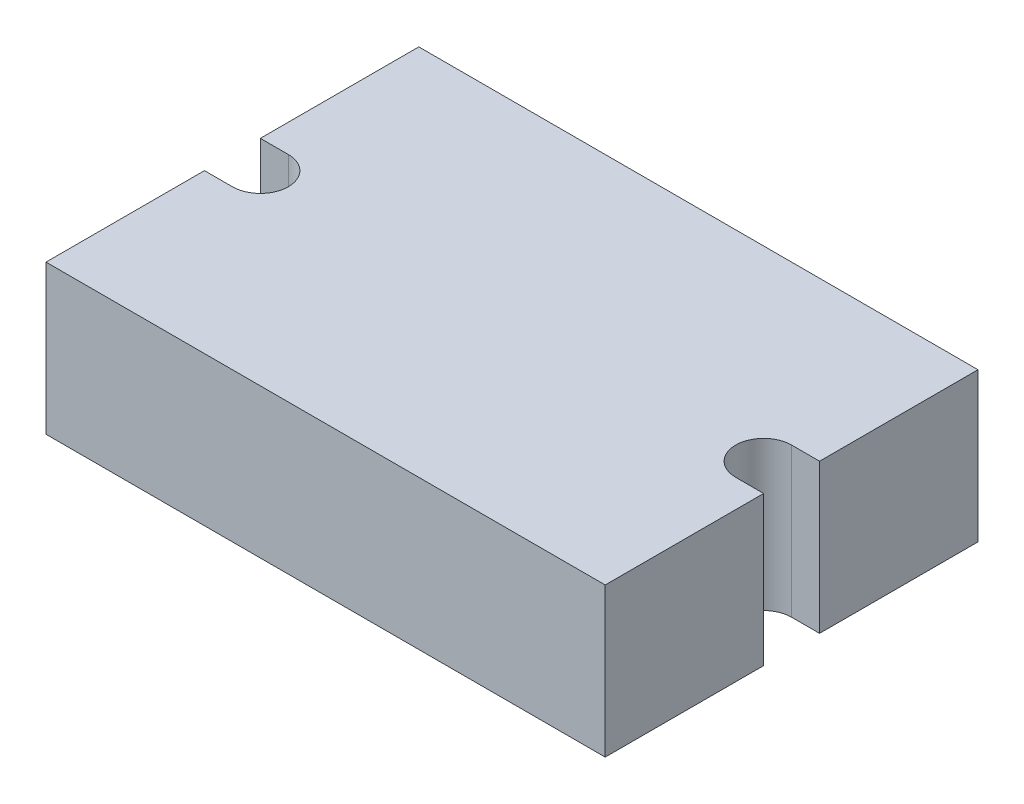
ISO-10303-21;
HEADER;
FILE_DESCRIPTION(('STEP AP214'),'2;1');
FILE_NAME('part.step','',(''),(''),'','','');
FILE_SCHEMA(('AUTOMOTIVE_DESIGN { 1 0 10303 214 1 1 1 1 }'));
ENDSEC;
DATA;
#1=APPLICATION_CONTEXT('core data for automotive mechanical design processes');
#2=APPLICATION_PROTOCOL_DEFINITION('international standard','automotive_design',2000,#1);
#3=PRODUCT_CONTEXT('',#1,'mechanical');
#4=PRODUCT('Part','Part','',(#3));
#5=PRODUCT_RELATED_PRODUCT_CATEGORY('part','',(#4));
#6=PRODUCT_DEFINITION_FORMATION('','',#4);
#7=PRODUCT_DEFINITION_CONTEXT('part definition',#1,'design');
#8=PRODUCT_DEFINITION('design','',#6,#7);
#9=PRODUCT_DEFINITION_SHAPE('','',#8);
#10=(LENGTH_UNIT() NAMED_UNIT(*) SI_UNIT(.MILLI.,.METRE.));
#11=(NAMED_UNIT(*) PLANE_ANGLE_UNIT() SI_UNIT($,.RADIAN.));
#12=(NAMED_UNIT(*) SI_UNIT($,.STERADIAN.) SOLID_ANGLE_UNIT());
#13=UNCERTAINTY_MEASURE_WITH_UNIT(LENGTH_MEASURE(1.E-05),#10,'distance_accuracy_value','');
#14=(GEOMETRIC_REPRESENTATION_CONTEXT(3) GLOBAL_UNCERTAINTY_ASSIGNED_CONTEXT((#13)) GLOBAL_UNIT_ASSIGNED_CONTEXT((#10,
#11,#12)) REPRESENTATION_CONTEXT('',''));
#15=CARTESIAN_POINT('',(0.,0.,0.));
#16=DIRECTION('',(0.,0.,1.));
#17=DIRECTION('',(1.,0.,0.));
#18=AXIS2_PLACEMENT_3D('',#15,#16,#17);
#19=CARTESIAN_POINT('',(0.,8.,-8.5));
#20=DIRECTION('',(1.,0.,0.));
#21=DIRECTION('',(0.,0.,-1.));
#22=AXIS2_PLACEMENT_3D('',#19,#20,#21);
#23=PLANE('',#22);
#24=DIRECTION('',(0.,0.,1.));
#25=VECTOR('',#24,1.);
#26=CARTESIAN_POINT('',(0.,0.,-8.5));
#27=LINE('',#26,#25);
#28=CARTESIAN_POINT('',(0.,0.,-8.5));
#29=VERTEX_POINT('',#28);
#30=CARTESIAN_POINT('',(0.,0.,0.));
#31=VERTEX_POINT('',#30);
#32=EDGE_CURVE('E168',#29,#31,#27,.T.);
#33=ORIENTED_EDGE('',*,*,#32,.T.);
#34=DIRECTION('',(0.,-1.,0.));
#35=VECTOR('',#34,1.);
#36=CARTESIAN_POINT('',(0.,8.,0.));
#37=LINE('',#36,#35);
#38=CARTESIAN_POINT('',(0.,8.,0.));
#39=VERTEX_POINT('',#38);
#40=EDGE_CURVE('E11',#39,#31,#37,.T.);
#41=ORIENTED_EDGE('',*,*,#40,.F.);
#42=DIRECTION('',(0.,0.,1.));
#43=VECTOR('',#42,1.);
#44=CARTESIAN_POINT('',(0.,8.,-8.5));
#45=LINE('',#44,#43);
#46=CARTESIAN_POINT('',(0.,8.,-8.5));
#47=VERTEX_POINT('',#46);
#48=EDGE_CURVE('E202',#47,#39,#45,.T.);
#49=ORIENTED_EDGE('',*,*,#48,.F.);
#50=DIRECTION('',(0.,-1.,0.));
#51=VECTOR('',#50,1.);
#52=CARTESIAN_POINT('',(0.,8.,-8.5));
#53=LINE('',#52,#51);
#54=EDGE_CURVE('E164',#47,#29,#53,.T.);
#55=ORIENTED_EDGE('',*,*,#54,.T.);
#56=EDGE_LOOP('',(#33,#41,#49,#55));
#57=FACE_BOUND('',#56,.T.);
#58=ADVANCED_FACE('F43',(#57),#23,.F.);
#59=CARTESIAN_POINT('',(0.,8.,0.));
#60=DIRECTION('',(0.,0.,-1.));
#61=DIRECTION('',(-1.,0.,0.));
#62=AXIS2_PLACEMENT_3D('',#59,#60,#61);
#63=PLANE('',#62);
#64=DIRECTION('',(1.,0.,0.));
#65=VECTOR('',#64,1.);
#66=CARTESIAN_POINT('',(0.,0.,0.));
#67=LINE('',#66,#65);
#68=CARTESIAN_POINT('',(30.,0.,0.));
#69=VERTEX_POINT('',#68);
#70=EDGE_CURVE('E172',#31,#69,#67,.T.);
#71=ORIENTED_EDGE('',*,*,#70,.T.);
#72=DIRECTION('',(0.,-1.,0.));
#73=VECTOR('',#72,1.);
#74=CARTESIAN_POINT('',(30.,8.,0.));
#75=LINE('',#74,#73);
#76=CARTESIAN_POINT('',(30.,8.,0.));
#77=VERTEX_POINT('',#76);
#78=EDGE_CURVE('E52',#77,#69,#75,.T.);
#79=ORIENTED_EDGE('',*,*,#78,.F.);
#80=DIRECTION('',(1.,0.,0.));
#81=VECTOR('',#80,1.);
#82=CARTESIAN_POINT('',(0.,8.,0.));
#83=LINE('',#82,#81);
#84=EDGE_CURVE('E115',#39,#77,#83,.T.);
#85=ORIENTED_EDGE('',*,*,#84,.F.);
#86=ORIENTED_EDGE('',*,*,#40,.T.);
#87=EDGE_LOOP('',(#71,#79,#85,#86));
#88=FACE_BOUND('',#87,.T.);
#89=ADVANCED_FACE('F296',(#88),#63,.F.);
#90=CARTESIAN_POINT('',(30.,8.,-8.5));
#91=DIRECTION('',(-1.,0.,0.));
#92=DIRECTION('',(0.,0.,1.));
#93=AXIS2_PLACEMENT_3D('',#90,#91,#92);
#94=PLANE('',#93);
#95=DIRECTION('',(0.,0.,-1.));
#96=VECTOR('',#95,1.);
#97=CARTESIAN_POINT('',(30.,0.,-8.5));
#98=LINE('',#97,#96);
#99=CARTESIAN_POINT('',(30.,0.,-8.5));
#100=VERTEX_POINT('',#99);
#101=EDGE_CURVE('E175',#69,#100,#98,.T.);
#102=ORIENTED_EDGE('',*,*,#101,.T.);
#103=DIRECTION('',(0.,-1.,0.));
#104=VECTOR('',#103,1.);
#105=CARTESIAN_POINT('',(30.,8.,-8.5));
#106=LINE('',#105,#104);
#107=CARTESIAN_POINT('',(30.,8.,-8.5));
#108=VERTEX_POINT('',#107);
#109=EDGE_CURVE('E229',#108,#100,#106,.T.);
#110=ORIENTED_EDGE('',*,*,#109,.F.);
#111=DIRECTION('',(0.,0.,-1.));
#112=VECTOR('',#111,1.);
#113=CARTESIAN_POINT('',(30.,8.,-8.5));
#114=LINE('',#113,#112);
#115=EDGE_CURVE('E239',#77,#108,#114,.T.);
#116=ORIENTED_EDGE('',*,*,#115,.F.);
#117=ORIENTED_EDGE('',*,*,#78,.T.);
#118=EDGE_LOOP('',(#102,#110,#116,#117));
#119=FACE_BOUND('',#118,.T.);
#120=ADVANCED_FACE('F237',(#119),#94,.F.);
#121=CARTESIAN_POINT('',(28.5,8.,-8.5));
#122=DIRECTION('',(0.,0.,1.));
#123=DIRECTION('',(1.,0.,0.));
#124=AXIS2_PLACEMENT_3D('',#121,#122,#123);
#125=PLANE('',#124);
#126=DIRECTION('',(-1.,0.,0.));
#127=VECTOR('',#126,1.);
#128=CARTESIAN_POINT('',(28.5,0.,-8.5));
#129=LINE('',#128,#127);
#130=CARTESIAN_POINT('',(28.5,0.,-8.5));
#131=VERTEX_POINT('',#130);
#132=EDGE_CURVE('E178',#100,#131,#129,.T.);
#133=ORIENTED_EDGE('',*,*,#132,.T.);
#134=DIRECTION('',(0.,-1.,0.));
#135=VECTOR('',#134,1.);
#136=CARTESIAN_POINT('',(28.5,8.,-8.5));
#137=LINE('',#136,#135);
#138=CARTESIAN_POINT('',(28.5,8.,-8.5));
#139=VERTEX_POINT('',#138);
#140=EDGE_CURVE('E225',#139,#131,#137,.T.);
#141=ORIENTED_EDGE('',*,*,#140,.F.);
#142=DIRECTION('',(-1.,0.,0.));
#143=VECTOR('',#142,1.);
#144=CARTESIAN_POINT('',(28.5,8.,-8.5));
#145=LINE('',#144,#143);
#146=EDGE_CURVE('E258',#108,#139,#145,.T.);
#147=ORIENTED_EDGE('',*,*,#146,.F.);
#148=ORIENTED_EDGE('',*,*,#109,.T.);
#149=EDGE_LOOP('',(#133,#141,#147,#148));
#150=FACE_BOUND('',#149,.T.);
#151=ADVANCED_FACE('F248',(#150),#125,.F.);
#152=CARTESIAN_POINT('',(28.5,8.,-10.));
#153=DIRECTION('',(0.,-1.,0.));
#154=DIRECTION('',(0.,0.,-1.));
#155=AXIS2_PLACEMENT_3D('',#152,#153,#154);
#156=CYLINDRICAL_SURFACE('',#155,1.5);
#157=CARTESIAN_POINT('',(28.5,0.,-10.));
#158=DIRECTION('',(0.,-1.,0.));
#159=DIRECTION('',(0.,0.,-1.));
#160=AXIS2_PLACEMENT_3D('',#157,#158,#159);
#161=CIRCLE('',#160,1.5);
#162=CARTESIAN_POINT('',(28.5,0.,-11.5));
#163=VERTEX_POINT('',#162);
#164=EDGE_CURVE('E181',#131,#163,#161,.T.);
#165=ORIENTED_EDGE('',*,*,#164,.T.);
#166=DIRECTION('',(0.,-1.,0.));
#167=VECTOR('',#166,1.);
#168=CARTESIAN_POINT('',(28.5,8.,-11.5));
#169=LINE('',#168,#167);
#170=CARTESIAN_POINT('',(28.5,8.,-11.5));
#171=VERTEX_POINT('',#170);
#172=EDGE_CURVE('E221',#171,#163,#169,.T.);
#173=ORIENTED_EDGE('',*,*,#172,.F.);
#174=CARTESIAN_POINT('',(28.5,8.,-10.));
#175=DIRECTION('',(0.,-1.,0.));
#176=DIRECTION('',(0.,0.,-1.));
#177=AXIS2_PLACEMENT_3D('',#174,#175,#176);
#178=CIRCLE('',#177,1.5);
#179=EDGE_CURVE('E254',#139,#171,#178,.T.);
#180=ORIENTED_EDGE('',*,*,#179,.F.);
#181=ORIENTED_EDGE('',*,*,#140,.T.);
#182=EDGE_LOOP('',(#165,#173,#180,#181));
#183=FACE_BOUND('',#182,.T.);
#184=ADVANCED_FACE('F252',(#183),#156,.F.);
#185=CARTESIAN_POINT('',(28.5,8.,-11.5));
#186=DIRECTION('',(0.,0.,-1.));
#187=DIRECTION('',(-1.,0.,0.));
#188=AXIS2_PLACEMENT_3D('',#185,#186,#187);
#189=PLANE('',#188);
#190=DIRECTION('',(1.,0.,0.));
#191=VECTOR('',#190,1.);
#192=CARTESIAN_POINT('',(28.5,0.,-11.5));
#193=LINE('',#192,#191);
#194=CARTESIAN_POINT('',(30.,0.,-11.5));
#195=VERTEX_POINT('',#194);
#196=EDGE_CURVE('E184',#163,#195,#193,.T.);
#197=ORIENTED_EDGE('',*,*,#196,.T.);
#198=DIRECTION('',(0.,-1.,0.));
#199=VECTOR('',#198,1.);
#200=CARTESIAN_POINT('',(30.,8.,-11.5));
#201=LINE('',#200,#199);
#202=CARTESIAN_POINT('',(30.,8.,-11.5));
#203=VERTEX_POINT('',#202);
#204=EDGE_CURVE('E217',#203,#195,#201,.T.);
#205=ORIENTED_EDGE('',*,*,#204,.F.);
#206=DIRECTION('',(1.,0.,0.));
#207=VECTOR('',#206,1.);
#208=CARTESIAN_POINT('',(28.5,8.,-11.5));
#209=LINE('',#208,#207);
#210=EDGE_CURVE('E257',#171,#203,#209,.T.);
#211=ORIENTED_EDGE('',*,*,#210,.F.);
#212=ORIENTED_EDGE('',*,*,#172,.T.);
#213=EDGE_LOOP('',(#197,#205,#211,#212));
#214=FACE_BOUND('',#213,.T.);
#215=ADVANCED_FACE('F309',(#214),#189,.F.);
#216=CARTESIAN_POINT('',(30.,8.,-11.5));
#217=DIRECTION('',(-1.,0.,0.));
#218=DIRECTION('',(0.,0.,1.));
#219=AXIS2_PLACEMENT_3D('',#216,#217,#218);
#220=PLANE('',#219);
#221=DIRECTION('',(0.,0.,-1.));
#222=VECTOR('',#221,1.);
#223=CARTESIAN_POINT('',(30.,0.,-11.5));
#224=LINE('',#223,#222);
#225=CARTESIAN_POINT('',(30.,0.,-20.));
#226=VERTEX_POINT('',#225);
#227=EDGE_CURVE('E187',#195,#226,#224,.T.);
#228=ORIENTED_EDGE('',*,*,#227,.T.);
#229=DIRECTION('',(0.,-1.,0.));
#230=VECTOR('',#229,1.);
#231=CARTESIAN_POINT('',(30.,8.,-20.));
#232=LINE('',#231,#230);
#233=CARTESIAN_POINT('',(30.,8.,-20.));
#234=VERTEX_POINT('',#233);
#235=EDGE_CURVE('E213',#234,#226,#232,.T.);
#236=ORIENTED_EDGE('',*,*,#235,.F.);
#237=DIRECTION('',(0.,0.,-1.));
#238=VECTOR('',#237,1.);
#239=CARTESIAN_POINT('',(30.,8.,-11.5));
#240=LINE('',#239,#238);
#241=EDGE_CURVE('E262',#203,#234,#240,.T.);
#242=ORIENTED_EDGE('',*,*,#241,.F.);
#243=ORIENTED_EDGE('',*,*,#204,.T.);
#244=EDGE_LOOP('',(#228,#236,#242,#243));
#245=FACE_BOUND('',#244,.T.);
#246=ADVANCED_FACE('F312',(#245),#220,.F.);
#247=CARTESIAN_POINT('',(0.,8.,-20.));
#248=DIRECTION('',(0.,0.,1.));
#249=DIRECTION('',(1.,0.,0.));
#250=AXIS2_PLACEMENT_3D('',#247,#248,#249);
#251=PLANE('',#250);
#252=DIRECTION('',(-1.,0.,0.));
#253=VECTOR('',#252,1.);
#254=CARTESIAN_POINT('',(0.,0.,-20.));
#255=LINE('',#254,#253);
#256=CARTESIAN_POINT('',(0.,0.,-20.));
#257=VERTEX_POINT('',#256);
#258=EDGE_CURVE('E190',#226,#257,#255,.T.);
#259=ORIENTED_EDGE('',*,*,#258,.T.);
#260=DIRECTION('',(0.,-1.,0.));
#261=VECTOR('',#260,1.);
#262=CARTESIAN_POINT('',(0.,8.,-20.));
#263=LINE('',#262,#261);
#264=CARTESIAN_POINT('',(0.,8.,-20.));
#265=VERTEX_POINT('',#264);
#266=EDGE_CURVE('E209',#265,#257,#263,.T.);
#267=ORIENTED_EDGE('',*,*,#266,.F.);
#268=DIRECTION('',(-1.,0.,0.));
#269=VECTOR('',#268,1.);
#270=CARTESIAN_POINT('',(0.,8.,-20.));
#271=LINE('',#270,#269);
#272=EDGE_CURVE('E269',#234,#265,#271,.T.);
#273=ORIENTED_EDGE('',*,*,#272,.F.);
#274=ORIENTED_EDGE('',*,*,#235,.T.);
#275=EDGE_LOOP('',(#259,#267,#273,#274));
#276=FACE_BOUND('',#275,.T.);
#277=ADVANCED_FACE('F277',(#276),#251,.F.);
#278=CARTESIAN_POINT('',(0.,8.,-11.5));
#279=DIRECTION('',(1.,0.,0.));
#280=DIRECTION('',(0.,0.,-1.));
#281=AXIS2_PLACEMENT_3D('',#278,#279,#280);
#282=PLANE('',#281);
#283=DIRECTION('',(0.,0.,1.));
#284=VECTOR('',#283,1.);
#285=CARTESIAN_POINT('',(0.,0.,-11.5));
#286=LINE('',#285,#284);
#287=CARTESIAN_POINT('',(0.,0.,-11.5));
#288=VERTEX_POINT('',#287);
#289=EDGE_CURVE('E193',#257,#288,#286,.T.);
#290=ORIENTED_EDGE('',*,*,#289,.T.);
#291=DIRECTION('',(0.,-1.,0.));
#292=VECTOR('',#291,1.);
#293=CARTESIAN_POINT('',(0.,8.,-11.5));
#294=LINE('',#293,#292);
#295=CARTESIAN_POINT('',(0.,8.,-11.5));
#296=VERTEX_POINT('',#295);
#297=EDGE_CURVE('E157',#296,#288,#294,.T.);
#298=ORIENTED_EDGE('',*,*,#297,.F.);
#299=DIRECTION('',(0.,0.,1.));
#300=VECTOR('',#299,1.);
#301=CARTESIAN_POINT('',(0.,8.,-11.5));
#302=LINE('',#301,#300);
#303=EDGE_CURVE('E146',#265,#296,#302,.T.);
#304=ORIENTED_EDGE('',*,*,#303,.F.);
#305=ORIENTED_EDGE('',*,*,#266,.T.);
#306=EDGE_LOOP('',(#290,#298,#304,#305));
#307=FACE_BOUND('',#306,.T.);
#308=ADVANCED_FACE('F281',(#307),#282,.F.);
#309=CARTESIAN_POINT('',(1.5,8.,-11.5));
#310=DIRECTION('',(0.,0.,-1.));
#311=DIRECTION('',(-1.,0.,0.));
#312=AXIS2_PLACEMENT_3D('',#309,#310,#311);
#313=PLANE('',#312);
#314=DIRECTION('',(1.,0.,0.));
#315=VECTOR('',#314,1.);
#316=CARTESIAN_POINT('',(1.5,0.,-11.5));
#317=LINE('',#316,#315);
#318=CARTESIAN_POINT('',(1.5,0.,-11.5));
#319=VERTEX_POINT('',#318);
#320=EDGE_CURVE('E155',#288,#319,#317,.T.);
#321=ORIENTED_EDGE('',*,*,#320,.T.);
#322=DIRECTION('',(0.,-1.,0.));
#323=VECTOR('',#322,1.);
#324=CARTESIAN_POINT('',(1.5,8.,-11.5));
#325=LINE('',#324,#323);
#326=CARTESIAN_POINT('',(1.5,8.,-11.5));
#327=VERTEX_POINT('',#326);
#328=EDGE_CURVE('E152',#327,#319,#325,.T.);
#329=ORIENTED_EDGE('',*,*,#328,.F.);
#330=DIRECTION('',(1.,0.,0.));
#331=VECTOR('',#330,1.);
#332=CARTESIAN_POINT('',(1.5,8.,-11.5));
#333=LINE('',#332,#331);
#334=EDGE_CURVE('E140',#296,#327,#333,.T.);
#335=ORIENTED_EDGE('',*,*,#334,.F.);
#336=ORIENTED_EDGE('',*,*,#297,.T.);
#337=EDGE_LOOP('',(#321,#329,#335,#336));
#338=FACE_BOUND('',#337,.T.);
#339=ADVANCED_FACE('F153',(#338),#313,.F.);
#340=CARTESIAN_POINT('',(1.5,8.,-10.));
#341=DIRECTION('',(0.,-1.,0.));
#342=DIRECTION('',(0.,0.,-1.));
#343=AXIS2_PLACEMENT_3D('',#340,#341,#342);
#344=CYLINDRICAL_SURFACE('',#343,1.5);
#345=CARTESIAN_POINT('',(1.5,0.,-10.));
#346=DIRECTION('',(0.,-1.,0.));
#347=DIRECTION('',(0.,0.,1.));
#348=AXIS2_PLACEMENT_3D('',#345,#346,#347);
#349=CIRCLE('',#348,1.5);
#350=CARTESIAN_POINT('',(1.5,0.,-8.5));
#351=VERTEX_POINT('',#350);
#352=EDGE_CURVE('E101',#319,#351,#349,.T.);
#353=ORIENTED_EDGE('',*,*,#352,.T.);
#354=DIRECTION('',(0.,-1.,0.));
#355=VECTOR('',#354,1.);
#356=CARTESIAN_POINT('',(1.5,8.,-8.5));
#357=LINE('',#356,#355);
#358=CARTESIAN_POINT('',(1.5,8.,-8.5));
#359=VERTEX_POINT('',#358);
#360=EDGE_CURVE('E158',#359,#351,#357,.T.);
#361=ORIENTED_EDGE('',*,*,#360,.F.);
#362=CARTESIAN_POINT('',(1.5,8.,-10.));
#363=DIRECTION('',(0.,-1.,0.));
#364=DIRECTION('',(0.,0.,1.));
#365=AXIS2_PLACEMENT_3D('',#362,#363,#364);
#366=CIRCLE('',#365,1.5);
#367=EDGE_CURVE('E144',#327,#359,#366,.T.);
#368=ORIENTED_EDGE('',*,*,#367,.F.);
#369=ORIENTED_EDGE('',*,*,#328,.T.);
#370=EDGE_LOOP('',(#353,#361,#368,#369));
#371=FACE_BOUND('',#370,.T.);
#372=ADVANCED_FACE('F160',(#371),#344,.F.);
#373=CARTESIAN_POINT('',(1.5,8.,-8.5));
#374=DIRECTION('',(0.,0.,1.));
#375=DIRECTION('',(1.,0.,0.));
#376=AXIS2_PLACEMENT_3D('',#373,#374,#375);
#377=PLANE('',#376);
#378=DIRECTION('',(-1.,0.,0.));
#379=VECTOR('',#378,1.);
#380=CARTESIAN_POINT('',(1.5,0.,-8.5));
#381=LINE('',#380,#379);
#382=EDGE_CURVE('E107',#351,#29,#381,.T.);
#383=ORIENTED_EDGE('',*,*,#382,.T.);
#384=ORIENTED_EDGE('',*,*,#54,.F.);
#385=DIRECTION('',(-1.,0.,0.));
#386=VECTOR('',#385,1.);
#387=CARTESIAN_POINT('',(1.5,8.,-8.5));
#388=LINE('',#387,#386);
#389=EDGE_CURVE('E60',#359,#47,#388,.T.);
#390=ORIENTED_EDGE('',*,*,#389,.F.);
#391=ORIENTED_EDGE('',*,*,#360,.T.);
#392=EDGE_LOOP('',(#383,#384,#390,#391));
#393=FACE_BOUND('',#392,.T.);
#394=ADVANCED_FACE('F285',(#393),#377,.F.);
#395=CARTESIAN_POINT('',(28.5,8.,-10.));
#396=DIRECTION('',(0.,-1.,0.));
#397=DIRECTION('',(0.,0.,-1.));
#398=AXIS2_PLACEMENT_3D('',#395,#396,#397);
#399=PLANE('',#398);
#400=ORIENTED_EDGE('',*,*,#48,.T.);
#401=ORIENTED_EDGE('',*,*,#84,.T.);
#402=ORIENTED_EDGE('',*,*,#115,.T.);
#403=ORIENTED_EDGE('',*,*,#146,.T.);
#404=ORIENTED_EDGE('',*,*,#179,.T.);
#405=ORIENTED_EDGE('',*,*,#210,.T.);
#406=ORIENTED_EDGE('',*,*,#241,.T.);
#407=ORIENTED_EDGE('',*,*,#272,.T.);
#408=ORIENTED_EDGE('',*,*,#303,.T.);
#409=ORIENTED_EDGE('',*,*,#334,.T.);
#410=ORIENTED_EDGE('',*,*,#367,.T.);
#411=ORIENTED_EDGE('',*,*,#389,.T.);
#412=EDGE_LOOP('',(#400,#401,#402,#403,#404,#405,#406,#407,#408,#409,#410,#411));
#413=FACE_BOUND('',#412,.T.);
#414=ADVANCED_FACE('F142',(#413),#399,.F.);
#415=CARTESIAN_POINT('',(28.5,0.,-10.));
#416=DIRECTION('',(0.,-1.,0.));
#417=DIRECTION('',(0.,0.,-1.));
#418=AXIS2_PLACEMENT_3D('',#415,#416,#417);
#419=PLANE('',#418);
#420=ORIENTED_EDGE('',*,*,#32,.F.);
#421=ORIENTED_EDGE('',*,*,#382,.F.);
#422=ORIENTED_EDGE('',*,*,#352,.F.);
#423=ORIENTED_EDGE('',*,*,#320,.F.);
#424=ORIENTED_EDGE('',*,*,#289,.F.);
#425=ORIENTED_EDGE('',*,*,#258,.F.);
#426=ORIENTED_EDGE('',*,*,#227,.F.);
#427=ORIENTED_EDGE('',*,*,#196,.F.);
#428=ORIENTED_EDGE('',*,*,#164,.F.);
#429=ORIENTED_EDGE('',*,*,#132,.F.);
#430=ORIENTED_EDGE('',*,*,#101,.F.);
#431=ORIENTED_EDGE('',*,*,#70,.F.);
#432=EDGE_LOOP('',(#420,#421,#422,#423,#424,#425,#426,#427,#428,#429,#430,#431));
#433=FACE_BOUND('',#432,.T.);
#434=ADVANCED_FACE('F243',(#433),#419,.T.);
#435=CLOSED_SHELL('',(#58,#89,#120,#151,#184,#215,#246,#277,#308,#339,#372,#394,#414,#434));
#436=MANIFOLD_SOLID_BREP('B2',#435);
#437=ADVANCED_BREP_SHAPE_REPRESENTATION('',(#18,#436),#14);
#438=SHAPE_DEFINITION_REPRESENTATION(#9,#437);
ENDSEC;
END-ISO-10303-21;
